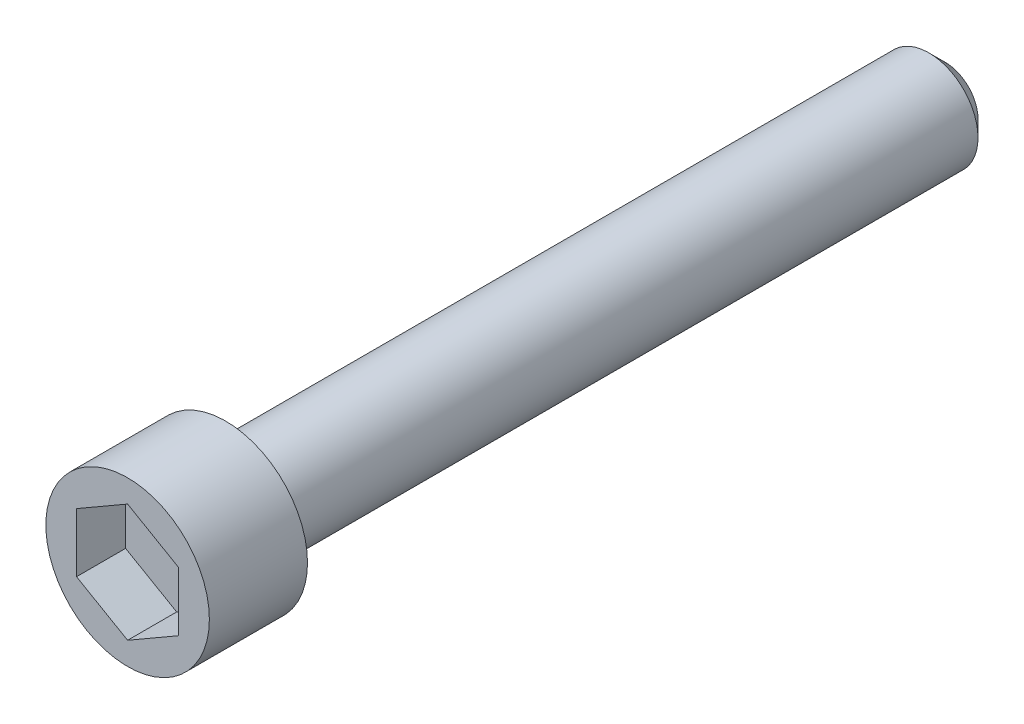
ISO-10303-21;
HEADER;
FILE_DESCRIPTION(('STEP AP214'),'2;1');
FILE_NAME('part.step','',(''),(''),'','','');
FILE_SCHEMA(('AUTOMOTIVE_DESIGN { 1 0 10303 214 1 1 1 1 }'));
ENDSEC;
DATA;
#1=APPLICATION_CONTEXT('core data for automotive mechanical design processes');
#2=APPLICATION_PROTOCOL_DEFINITION('international standard','automotive_design',2000,#1);
#3=PRODUCT_CONTEXT('',#1,'mechanical');
#4=PRODUCT('Part','Part','',(#3));
#5=PRODUCT_RELATED_PRODUCT_CATEGORY('part','',(#4));
#6=PRODUCT_DEFINITION_FORMATION('','',#4);
#7=PRODUCT_DEFINITION_CONTEXT('part definition',#1,'design');
#8=PRODUCT_DEFINITION('design','',#6,#7);
#9=PRODUCT_DEFINITION_SHAPE('','',#8);
#10=(LENGTH_UNIT() NAMED_UNIT(*) SI_UNIT(.MILLI.,.METRE.));
#11=(NAMED_UNIT(*) PLANE_ANGLE_UNIT() SI_UNIT($,.RADIAN.));
#12=(NAMED_UNIT(*) SI_UNIT($,.STERADIAN.) SOLID_ANGLE_UNIT());
#13=UNCERTAINTY_MEASURE_WITH_UNIT(LENGTH_MEASURE(1.E-05),#10,'distance_accuracy_value','');
#14=(GEOMETRIC_REPRESENTATION_CONTEXT(3) GLOBAL_UNCERTAINTY_ASSIGNED_CONTEXT((#13)) GLOBAL_UNIT_ASSIGNED_CONTEXT((#10,
#11,#12)) REPRESENTATION_CONTEXT('',''));
#15=CARTESIAN_POINT('',(0.,0.,0.));
#16=DIRECTION('',(0.,0.,1.));
#17=DIRECTION('',(1.,0.,0.));
#18=AXIS2_PLACEMENT_3D('',#15,#16,#17);
#19=CARTESIAN_POINT('',(0.,0.,22.));
#20=DIRECTION('',(0.,0.,-1.));
#21=DIRECTION('',(-1.,0.,0.));
#22=AXIS2_PLACEMENT_3D('',#19,#20,#21);
#23=CYLINDRICAL_SURFACE('',#22,1.5);
#24=CARTESIAN_POINT('',(0.,0.,0.5));
#25=DIRECTION('',(0.,0.,1.));
#26=DIRECTION('',(1.,0.,0.));
#27=AXIS2_PLACEMENT_3D('',#24,#25,#26);
#28=CIRCLE('',#27,1.5);
#29=CARTESIAN_POINT('',(1.5,0.,0.5));
#30=VERTEX_POINT('',#29);
#31=EDGE_CURVE('E44',#30,#30,#28,.T.);
#32=ORIENTED_EDGE('',*,*,#31,.T.);
#33=EDGE_LOOP('',(#32));
#34=FACE_BOUND('',#33,.T.);
#35=CARTESIAN_POINT('',(0.,0.,22.));
#36=DIRECTION('',(0.,0.,1.));
#37=DIRECTION('',(1.,0.,0.));
#38=AXIS2_PLACEMENT_3D('',#35,#36,#37);
#39=CIRCLE('',#38,1.5);
#40=CARTESIAN_POINT('',(1.5,0.,22.));
#41=VERTEX_POINT('',#40);
#42=EDGE_CURVE('E147',#41,#41,#39,.T.);
#43=ORIENTED_EDGE('',*,*,#42,.F.);
#44=EDGE_LOOP('',(#43));
#45=FACE_BOUND('',#44,.T.);
#46=ADVANCED_FACE('F36',(#34,#45),#23,.T.);
#47=CARTESIAN_POINT('',(0.,0.,0.));
#48=DIRECTION('',(0.,0.,1.));
#49=DIRECTION('',(1.,0.,0.));
#50=AXIS2_PLACEMENT_3D('',#47,#48,#49);
#51=PLANE('',#50);
#52=CARTESIAN_POINT('',(0.,0.,0.));
#53=DIRECTION('',(0.,0.,1.));
#54=DIRECTION('',(1.,0.,0.));
#55=AXIS2_PLACEMENT_3D('',#52,#53,#54);
#56=CIRCLE('',#55,0.999999999999994);
#57=CARTESIAN_POINT('',(0.999999999999994,0.,0.));
#58=VERTEX_POINT('',#57);
#59=EDGE_CURVE('E11',#58,#58,#56,.F.);
#60=ORIENTED_EDGE('',*,*,#59,.T.);
#61=EDGE_LOOP('',(#60));
#62=FACE_BOUND('',#61,.T.);
#63=ADVANCED_FACE('F165',(#62),#51,.F.);
#64=CARTESIAN_POINT('',(0.,0.,25.));
#65=DIRECTION('',(0.,0.,-1.));
#66=DIRECTION('',(-1.,0.,0.));
#67=AXIS2_PLACEMENT_3D('',#64,#65,#66);
#68=CYLINDRICAL_SURFACE('',#67,2.5);
#69=CARTESIAN_POINT('',(0.,0.,25.));
#70=DIRECTION('',(0.,0.,1.));
#71=DIRECTION('',(1.,0.,0.));
#72=AXIS2_PLACEMENT_3D('',#69,#70,#71);
#73=CIRCLE('',#72,2.5);
#74=CARTESIAN_POINT('',(2.5,0.,25.));
#75=VERTEX_POINT('',#74);
#76=EDGE_CURVE('E144',#75,#75,#73,.T.);
#77=ORIENTED_EDGE('',*,*,#76,.F.);
#78=EDGE_LOOP('',(#77));
#79=FACE_BOUND('',#78,.T.);
#80=CARTESIAN_POINT('',(0.,0.,22.));
#81=DIRECTION('',(0.,0.,1.));
#82=DIRECTION('',(1.,0.,0.));
#83=AXIS2_PLACEMENT_3D('',#80,#81,#82);
#84=CIRCLE('',#83,2.5);
#85=CARTESIAN_POINT('',(2.5,0.,22.));
#86=VERTEX_POINT('',#85);
#87=EDGE_CURVE('E138',#86,#86,#84,.T.);
#88=ORIENTED_EDGE('',*,*,#87,.T.);
#89=EDGE_LOOP('',(#88));
#90=FACE_BOUND('',#89,.T.);
#91=ADVANCED_FACE('F169',(#79,#90),#68,.T.);
#92=CARTESIAN_POINT('',(0.,0.,25.));
#93=DIRECTION('',(0.,0.,1.));
#94=DIRECTION('',(1.,0.,0.));
#95=AXIS2_PLACEMENT_3D('',#92,#93,#94);
#96=PLANE('',#95);
#97=DIRECTION('',(-0.866025403784442,0.499999999999995,0.));
#98=VECTOR('',#97,1.);
#99=CARTESIAN_POINT('',(1.56177486979958,0.901691141492407,25.));
#100=LINE('',#99,#98);
#101=CARTESIAN_POINT('',(1.56177486979958,0.901691141492407,25.));
#102=VERTEX_POINT('',#101);
#103=CARTESIAN_POINT('',(0.,1.80338228298478,25.));
#104=VERTEX_POINT('',#103);
#105=EDGE_CURVE('E51',#102,#104,#100,.T.);
#106=ORIENTED_EDGE('',*,*,#105,.F.);
#107=DIRECTION('',(0.,1.,0.));
#108=VECTOR('',#107,1.);
#109=CARTESIAN_POINT('',(1.5617748697996,-0.901691141492374,25.));
#110=LINE('',#109,#108);
#111=CARTESIAN_POINT('',(1.5617748697996,-0.901691141492374,25.));
#112=VERTEX_POINT('',#111);
#113=EDGE_CURVE('E134',#112,#102,#110,.T.);
#114=ORIENTED_EDGE('',*,*,#113,.F.);
#115=DIRECTION('',(0.866025403784435,0.500000000000007,0.));
#116=VECTOR('',#115,1.);
#117=CARTESIAN_POINT('',(0.,-1.80338228298478,25.));
#118=LINE('',#117,#116);
#119=CARTESIAN_POINT('',(0.,-1.80338228298478,25.));
#120=VERTEX_POINT('',#119);
#121=EDGE_CURVE('E132',#120,#112,#118,.T.);
#122=ORIENTED_EDGE('',*,*,#121,.F.);
#123=DIRECTION('',(0.866025403784441,-0.499999999999995,0.));
#124=VECTOR('',#123,1.);
#125=CARTESIAN_POINT('',(-1.56177486979959,-0.901691141492395,25.));
#126=LINE('',#125,#124);
#127=CARTESIAN_POINT('',(-1.56177486979959,-0.901691141492395,25.));
#128=VERTEX_POINT('',#127);
#129=EDGE_CURVE('E99',#128,#120,#126,.T.);
#130=ORIENTED_EDGE('',*,*,#129,.F.);
#131=DIRECTION('',(0.,-1.,0.));
#132=VECTOR('',#131,1.);
#133=CARTESIAN_POINT('',(-1.5617748697996,0.901691141492385,25.));
#134=LINE('',#133,#132);
#135=CARTESIAN_POINT('',(-1.5617748697996,0.901691141492385,25.));
#136=VERTEX_POINT('',#135);
#137=EDGE_CURVE('E128',#136,#128,#134,.T.);
#138=ORIENTED_EDGE('',*,*,#137,.F.);
#139=DIRECTION('',(-0.866025403784438,-0.500000000000001,0.));
#140=VECTOR('',#139,1.);
#141=CARTESIAN_POINT('',(0.,1.80338228298478,25.));
#142=LINE('',#141,#140);
#143=EDGE_CURVE('E125',#104,#136,#142,.T.);
#144=ORIENTED_EDGE('',*,*,#143,.F.);
#145=EDGE_LOOP('',(#106,#114,#122,#130,#138,#144));
#146=FACE_BOUND('',#145,.T.);
#147=ORIENTED_EDGE('',*,*,#76,.T.);
#148=EDGE_LOOP('',(#147));
#149=FACE_BOUND('',#148,.T.);
#150=ADVANCED_FACE('F175',(#146,#149),#96,.T.);
#151=CARTESIAN_POINT('',(0.,0.,22.));
#152=DIRECTION('',(0.,0.,1.));
#153=DIRECTION('',(1.,0.,0.));
#154=AXIS2_PLACEMENT_3D('',#151,#152,#153);
#155=PLANE('',#154);
#156=ORIENTED_EDGE('',*,*,#42,.T.);
#157=EDGE_LOOP('',(#156));
#158=FACE_BOUND('',#157,.T.);
#159=ORIENTED_EDGE('',*,*,#87,.F.);
#160=EDGE_LOOP('',(#159));
#161=FACE_BOUND('',#160,.T.);
#162=ADVANCED_FACE('F177',(#158,#161),#155,.F.);
#163=CARTESIAN_POINT('',(1.56177486979958,0.901691141492407,23.5));
#164=DIRECTION('',(0.499999999999995,0.866025403784441,0.));
#165=DIRECTION('',(-0.866025403784442,0.499999999999995,0.));
#166=AXIS2_PLACEMENT_3D('',#163,#164,#165);
#167=PLANE('',#166);
#168=ORIENTED_EDGE('',*,*,#105,.T.);
#169=DIRECTION('',(0.,0.,1.));
#170=VECTOR('',#169,1.);
#171=CARTESIAN_POINT('',(0.,1.80338228298478,23.5));
#172=LINE('',#171,#170);
#173=CARTESIAN_POINT('',(0.,1.80338228298478,23.5));
#174=VERTEX_POINT('',#173);
#175=EDGE_CURVE('E81',#174,#104,#172,.T.);
#176=ORIENTED_EDGE('',*,*,#175,.F.);
#177=DIRECTION('',(-0.866025403784442,0.499999999999995,0.));
#178=VECTOR('',#177,1.);
#179=CARTESIAN_POINT('',(1.56177486979958,0.901691141492407,23.5));
#180=LINE('',#179,#178);
#181=CARTESIAN_POINT('',(1.56177486979958,0.901691141492407,23.5));
#182=VERTEX_POINT('',#181);
#183=EDGE_CURVE('E136',#182,#174,#180,.T.);
#184=ORIENTED_EDGE('',*,*,#183,.F.);
#185=DIRECTION('',(0.,0.,1.));
#186=VECTOR('',#185,1.);
#187=CARTESIAN_POINT('',(1.56177486979958,0.901691141492407,23.5));
#188=LINE('',#187,#186);
#189=EDGE_CURVE('E59',#182,#102,#188,.T.);
#190=ORIENTED_EDGE('',*,*,#189,.T.);
#191=EDGE_LOOP('',(#168,#176,#184,#190));
#192=FACE_BOUND('',#191,.T.);
#193=ADVANCED_FACE('F180',(#192),#167,.F.);
#194=CARTESIAN_POINT('',(1.5617748697996,-0.901691141492374,23.5));
#195=DIRECTION('',(1.,0.,0.));
#196=DIRECTION('',(0.,1.,0.));
#197=AXIS2_PLACEMENT_3D('',#194,#195,#196);
#198=PLANE('',#197);
#199=ORIENTED_EDGE('',*,*,#113,.T.);
#200=ORIENTED_EDGE('',*,*,#189,.F.);
#201=DIRECTION('',(0.,1.,0.));
#202=VECTOR('',#201,1.);
#203=CARTESIAN_POINT('',(1.5617748697996,-0.901691141492374,23.5));
#204=LINE('',#203,#202);
#205=CARTESIAN_POINT('',(1.5617748697996,-0.901691141492374,23.5));
#206=VERTEX_POINT('',#205);
#207=EDGE_CURVE('E111',#206,#182,#204,.T.);
#208=ORIENTED_EDGE('',*,*,#207,.F.);
#209=DIRECTION('',(0.,0.,1.));
#210=VECTOR('',#209,1.);
#211=CARTESIAN_POINT('',(1.5617748697996,-0.901691141492374,23.5));
#212=LINE('',#211,#210);
#213=EDGE_CURVE('E103',#206,#112,#212,.T.);
#214=ORIENTED_EDGE('',*,*,#213,.T.);
#215=EDGE_LOOP('',(#199,#200,#208,#214));
#216=FACE_BOUND('',#215,.T.);
#217=ADVANCED_FACE('F187',(#216),#198,.F.);
#218=CARTESIAN_POINT('',(0.,-1.80338228298478,23.5));
#219=DIRECTION('',(0.500000000000007,-0.866025403784435,0.));
#220=DIRECTION('',(0.866025403784434,0.500000000000007,0.));
#221=AXIS2_PLACEMENT_3D('',#218,#219,#220);
#222=PLANE('',#221);
#223=ORIENTED_EDGE('',*,*,#121,.T.);
#224=ORIENTED_EDGE('',*,*,#213,.F.);
#225=DIRECTION('',(0.866025403784435,0.500000000000007,0.));
#226=VECTOR('',#225,1.);
#227=CARTESIAN_POINT('',(0.,-1.80338228298478,23.5));
#228=LINE('',#227,#226);
#229=CARTESIAN_POINT('',(0.,-1.80338228298478,23.5));
#230=VERTEX_POINT('',#229);
#231=EDGE_CURVE('E107',#230,#206,#228,.T.);
#232=ORIENTED_EDGE('',*,*,#231,.F.);
#233=DIRECTION('',(0.,0.,1.));
#234=VECTOR('',#233,1.);
#235=CARTESIAN_POINT('',(0.,-1.80338228298478,23.5));
#236=LINE('',#235,#234);
#237=EDGE_CURVE('E92',#230,#120,#236,.T.);
#238=ORIENTED_EDGE('',*,*,#237,.T.);
#239=EDGE_LOOP('',(#223,#224,#232,#238));
#240=FACE_BOUND('',#239,.T.);
#241=ADVANCED_FACE('F108',(#240),#222,.F.);
#242=CARTESIAN_POINT('',(-1.56177486979959,-0.901691141492395,23.5));
#243=DIRECTION('',(-0.499999999999995,-0.866025403784441,0.));
#244=DIRECTION('',(0.866025403784442,-0.499999999999995,0.));
#245=AXIS2_PLACEMENT_3D('',#242,#243,#244);
#246=PLANE('',#245);
#247=ORIENTED_EDGE('',*,*,#129,.T.);
#248=ORIENTED_EDGE('',*,*,#237,.F.);
#249=DIRECTION('',(0.866025403784441,-0.499999999999995,0.));
#250=VECTOR('',#249,1.);
#251=CARTESIAN_POINT('',(-1.56177486979959,-0.901691141492395,23.5));
#252=LINE('',#251,#250);
#253=CARTESIAN_POINT('',(-1.56177486979959,-0.901691141492395,23.5));
#254=VERTEX_POINT('',#253);
#255=EDGE_CURVE('E96',#254,#230,#252,.T.);
#256=ORIENTED_EDGE('',*,*,#255,.F.);
#257=DIRECTION('',(0.,0.,1.));
#258=VECTOR('',#257,1.);
#259=CARTESIAN_POINT('',(-1.56177486979959,-0.901691141492395,23.5));
#260=LINE('',#259,#258);
#261=EDGE_CURVE('E104',#254,#128,#260,.T.);
#262=ORIENTED_EDGE('',*,*,#261,.T.);
#263=EDGE_LOOP('',(#247,#248,#256,#262));
#264=FACE_BOUND('',#263,.T.);
#265=ADVANCED_FACE('F94',(#264),#246,.F.);
#266=CARTESIAN_POINT('',(-1.5617748697996,0.901691141492385,23.5));
#267=DIRECTION('',(-1.,0.,0.));
#268=DIRECTION('',(0.,-1.,0.));
#269=AXIS2_PLACEMENT_3D('',#266,#267,#268);
#270=PLANE('',#269);
#271=ORIENTED_EDGE('',*,*,#137,.T.);
#272=ORIENTED_EDGE('',*,*,#261,.F.);
#273=DIRECTION('',(0.,-1.,0.));
#274=VECTOR('',#273,1.);
#275=CARTESIAN_POINT('',(-1.5617748697996,0.901691141492385,23.5));
#276=LINE('',#275,#274);
#277=CARTESIAN_POINT('',(-1.5617748697996,0.901691141492385,23.5));
#278=VERTEX_POINT('',#277);
#279=EDGE_CURVE('E117',#278,#254,#276,.T.);
#280=ORIENTED_EDGE('',*,*,#279,.F.);
#281=DIRECTION('',(0.,0.,1.));
#282=VECTOR('',#281,1.);
#283=CARTESIAN_POINT('',(-1.5617748697996,0.901691141492385,23.5));
#284=LINE('',#283,#282);
#285=EDGE_CURVE('E141',#278,#136,#284,.T.);
#286=ORIENTED_EDGE('',*,*,#285,.T.);
#287=EDGE_LOOP('',(#271,#272,#280,#286));
#288=FACE_BOUND('',#287,.T.);
#289=ADVANCED_FACE('F190',(#288),#270,.F.);
#290=CARTESIAN_POINT('',(0.,1.80338228298478,23.5));
#291=DIRECTION('',(-0.500000000000001,0.866025403784438,0.));
#292=DIRECTION('',(-0.866025403784438,-0.500000000000001,0.));
#293=AXIS2_PLACEMENT_3D('',#290,#291,#292);
#294=PLANE('',#293);
#295=ORIENTED_EDGE('',*,*,#143,.T.);
#296=ORIENTED_EDGE('',*,*,#285,.F.);
#297=DIRECTION('',(-0.866025403784438,-0.500000000000001,0.));
#298=VECTOR('',#297,1.);
#299=CARTESIAN_POINT('',(0.,1.80338228298478,23.5));
#300=LINE('',#299,#298);
#301=EDGE_CURVE('E119',#174,#278,#300,.T.);
#302=ORIENTED_EDGE('',*,*,#301,.F.);
#303=ORIENTED_EDGE('',*,*,#175,.T.);
#304=EDGE_LOOP('',(#295,#296,#302,#303));
#305=FACE_BOUND('',#304,.T.);
#306=ADVANCED_FACE('F161',(#305),#294,.F.);
#307=CARTESIAN_POINT('',(0.,0.,23.5));
#308=DIRECTION('',(0.,0.,1.));
#309=DIRECTION('',(1.,0.,0.));
#310=AXIS2_PLACEMENT_3D('',#307,#308,#309);
#311=PLANE('',#310);
#312=ORIENTED_EDGE('',*,*,#183,.T.);
#313=ORIENTED_EDGE('',*,*,#301,.T.);
#314=ORIENTED_EDGE('',*,*,#279,.T.);
#315=ORIENTED_EDGE('',*,*,#255,.T.);
#316=ORIENTED_EDGE('',*,*,#231,.T.);
#317=ORIENTED_EDGE('',*,*,#207,.T.);
#318=EDGE_LOOP('',(#312,#313,#314,#315,#316,#317));
#319=FACE_BOUND('',#318,.T.);
#320=ADVANCED_FACE('F114',(#319),#311,.T.);
#321=CARTESIAN_POINT('',(0.,0.,0.5));
#322=DIRECTION('',(0.,0.,1.));
#323=DIRECTION('',(1.,0.,0.));
#324=AXIS2_PLACEMENT_3D('',#321,#322,#323);
#325=CONICAL_SURFACE('',#324,1.5,0.785398163397455);
#326=ORIENTED_EDGE('',*,*,#59,.F.);
#327=EDGE_LOOP('',(#326));
#328=FACE_BOUND('',#327,.T.);
#329=ORIENTED_EDGE('',*,*,#31,.F.);
#330=EDGE_LOOP('',(#329));
#331=FACE_BOUND('',#330,.T.);
#332=ADVANCED_FACE('F38',(#328,#331),#325,.T.);
#333=CLOSED_SHELL('',(#46,#63,#91,#150,#162,#193,#217,#241,#265,#289,#306,#320,#332));
#334=MANIFOLD_SOLID_BREP('B2',#333);
#335=ADVANCED_BREP_SHAPE_REPRESENTATION('',(#18,#334),#14);
#336=SHAPE_DEFINITION_REPRESENTATION(#9,#335);
ENDSEC;
END-ISO-10303-21;
